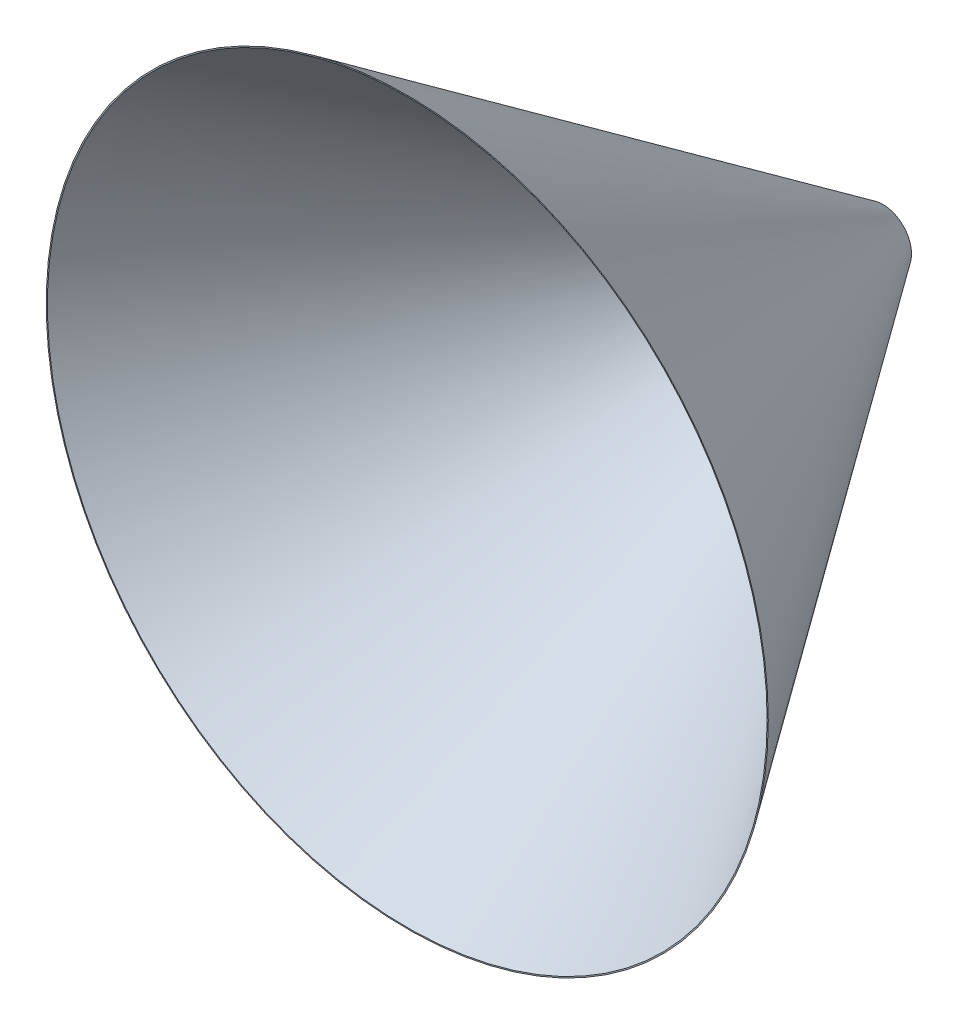
ISO-10303-21;
HEADER;
FILE_DESCRIPTION(('STEP AP214'),'2;1');
FILE_NAME('part.step','',(''),(''),'','','');
FILE_SCHEMA(('AUTOMOTIVE_DESIGN { 1 0 10303 214 1 1 1 1 }'));
ENDSEC;
DATA;
#1=APPLICATION_CONTEXT('core data for automotive mechanical design processes');
#2=APPLICATION_PROTOCOL_DEFINITION('international standard','automotive_design',2000,#1);
#3=PRODUCT_CONTEXT('',#1,'mechanical');
#4=PRODUCT('Part','Part','',(#3));
#5=PRODUCT_RELATED_PRODUCT_CATEGORY('part','',(#4));
#6=PRODUCT_DEFINITION_FORMATION('','',#4);
#7=PRODUCT_DEFINITION_CONTEXT('part definition',#1,'design');
#8=PRODUCT_DEFINITION('design','',#6,#7);
#9=PRODUCT_DEFINITION_SHAPE('','',#8);
#10=(LENGTH_UNIT() NAMED_UNIT(*) SI_UNIT(.MILLI.,.METRE.));
#11=(NAMED_UNIT(*) PLANE_ANGLE_UNIT() SI_UNIT($,.RADIAN.));
#12=(NAMED_UNIT(*) SI_UNIT($,.STERADIAN.) SOLID_ANGLE_UNIT());
#13=UNCERTAINTY_MEASURE_WITH_UNIT(LENGTH_MEASURE(1.E-05),#10,'distance_accuracy_value','');
#14=(GEOMETRIC_REPRESENTATION_CONTEXT(3) GLOBAL_UNCERTAINTY_ASSIGNED_CONTEXT((#13)) GLOBAL_UNIT_ASSIGNED_CONTEXT((#10,
#11,#12)) REPRESENTATION_CONTEXT('',''));
#15=CARTESIAN_POINT('',(0.,0.,0.));
#16=DIRECTION('',(0.,0.,1.));
#17=DIRECTION('',(1.,0.,0.));
#18=AXIS2_PLACEMENT_3D('',#15,#16,#17);
#19=CARTESIAN_POINT('',(0.,0.,0.));
#20=DIRECTION('',(0.,0.,1.));
#21=DIRECTION('',(1.,0.,0.));
#22=AXIS2_PLACEMENT_3D('',#19,#20,#21);
#23=CONICAL_SURFACE('',#22,3.,0.60999257357202);
#24=CARTESIAN_POINT('',(0.,0.,50.));
#25=DIRECTION('',(0.,0.,1.));
#26=DIRECTION('',(1.,0.,0.));
#27=AXIS2_PLACEMENT_3D('',#24,#25,#26);
#28=CIRCLE('',#27,37.9453904094492);
#29=CARTESIAN_POINT('',(37.9453904094492,0.,50.));
#30=VERTEX_POINT('',#29);
#31=EDGE_CURVE('E10',#30,#30,#28,.T.);
#32=CARTESIAN_POINT('',(0.,0.,0.));
#33=DIRECTION('',(0.,0.,1.));
#34=DIRECTION('',(1.,0.,0.));
#35=AXIS2_PLACEMENT_3D('',#32,#33,#34);
#36=CIRCLE('',#35,3.);
#37=CARTESIAN_POINT('',(3.,0.,0.));
#38=VERTEX_POINT('',#37);
#39=EDGE_CURVE('E38',#38,#38,#36,.T.);
#40=CARTESIAN_POINT('',(37.9453904094492,0.,50.));
#41=CARTESIAN_POINT('',(37.5813759260174,0.,49.4791666666667));
#42=CARTESIAN_POINT('',(37.2173614425857,0.,48.9583333333333));
#43=CARTESIAN_POINT('',(36.4893324757221,0.,47.9166666666667));
#44=CARTESIAN_POINT('',(36.1253179922904,0.,47.3958333333333));
#45=CARTESIAN_POINT('',(35.3972890254268,0.,46.3541666666667));
#46=CARTESIAN_POINT('',(35.0332745419951,0.,45.8333333333333));
#47=CARTESIAN_POINT('',(34.3052455751316,0.,44.7916666666667));
#48=CARTESIAN_POINT('',(33.9412310916998,0.,44.2708333333333));
#49=CARTESIAN_POINT('',(33.2132021248363,0.,43.2291666666667));
#50=CARTESIAN_POINT('',(32.8491876414045,0.,42.7083333333333));
#51=CARTESIAN_POINT('',(32.121158674541,0.,41.6666666666667));
#52=CARTESIAN_POINT('',(31.7571441911092,0.,41.1458333333333));
#53=CARTESIAN_POINT('',(31.0291152242457,0.,40.1041666666667));
#54=CARTESIAN_POINT('',(30.6651007408139,0.,39.5833333333333));
#55=CARTESIAN_POINT('',(29.9370717739504,0.,38.5416666666667));
#56=CARTESIAN_POINT('',(29.5730572905186,0.,38.0208333333333));
#57=CARTESIAN_POINT('',(28.8450283236551,0.,36.9791666666667));
#58=CARTESIAN_POINT('',(28.4810138402234,0.,36.4583333333333));
#59=CARTESIAN_POINT('',(27.7529848733598,0.,35.4166666666667));
#60=CARTESIAN_POINT('',(27.3889703899281,0.,34.8958333333333));
#61=CARTESIAN_POINT('',(26.6609414230645,0.,33.8541666666667));
#62=CARTESIAN_POINT('',(26.2969269396328,0.,33.3333333333333));
#63=CARTESIAN_POINT('',(25.5688979727693,0.,32.2916666666667));
#64=CARTESIAN_POINT('',(25.2048834893375,0.,31.7708333333333));
#65=CARTESIAN_POINT('',(24.476854522474,0.,30.7291666666667));
#66=CARTESIAN_POINT('',(24.1128400390422,0.,30.2083333333333));
#67=CARTESIAN_POINT('',(23.3848110721787,0.,29.1666666666667));
#68=CARTESIAN_POINT('',(23.0207965887469,0.,28.6458333333333));
#69=CARTESIAN_POINT('',(22.2927676218834,0.,27.6041666666667));
#70=CARTESIAN_POINT('',(21.9287531384516,0.,27.0833333333333));
#71=CARTESIAN_POINT('',(21.2007241715881,0.,26.0416666666667));
#72=CARTESIAN_POINT('',(20.8367096881564,0.,25.5208333333333));
#73=CARTESIAN_POINT('',(20.1086807212928,0.,24.4791666666667));
#74=CARTESIAN_POINT('',(19.7446662378611,0.,23.9583333333333));
#75=CARTESIAN_POINT('',(19.0166372709975,0.,22.9166666666667));
#76=CARTESIAN_POINT('',(18.6526227875658,0.,22.3958333333333));
#77=CARTESIAN_POINT('',(17.9245938207023,0.,21.3541666666667));
#78=CARTESIAN_POINT('',(17.5605793372705,0.,20.8333333333333));
#79=CARTESIAN_POINT('',(16.832550370407,0.,19.7916666666667));
#80=CARTESIAN_POINT('',(16.4685358869752,0.,19.2708333333333));
#81=CARTESIAN_POINT('',(15.7405069201117,0.,18.2291666666667));
#82=CARTESIAN_POINT('',(15.3764924366799,0.,17.7083333333333));
#83=CARTESIAN_POINT('',(14.6484634698164,0.,16.6666666666667));
#84=CARTESIAN_POINT('',(14.2844489863846,0.,16.1458333333333));
#85=CARTESIAN_POINT('',(13.5564200195211,0.,15.1041666666667));
#86=CARTESIAN_POINT('',(13.1924055360893,0.,14.5833333333333));
#87=CARTESIAN_POINT('',(12.4643765692258,0.,13.5416666666667));
#88=CARTESIAN_POINT('',(12.1003620857941,0.,13.0208333333333));
#89=CARTESIAN_POINT('',(11.3723331189305,0.,11.9791666666667));
#90=CARTESIAN_POINT('',(11.0083186354988,0.,11.4583333333333));
#91=CARTESIAN_POINT('',(10.2802896686352,0.,10.4166666666667));
#92=CARTESIAN_POINT('',(9.91627518520349,0.,9.89583333333333));
#93=CARTESIAN_POINT('',(9.18824621833996,0.,8.85416666666667));
#94=CARTESIAN_POINT('',(8.8242317349082,0.,8.33333333333333));
#95=CARTESIAN_POINT('',(8.09620276804467,0.,7.29166666666667));
#96=CARTESIAN_POINT('',(7.73218828461291,0.,6.77083333333333));
#97=CARTESIAN_POINT('',(7.00415931774938,0.,5.72916666666666));
#98=CARTESIAN_POINT('',(6.64014483431762,0.,5.20833333333333));
#99=CARTESIAN_POINT('',(5.9121158674541,0.,4.16666666666667));
#100=CARTESIAN_POINT('',(5.54810138402234,0.,3.64583333333333));
#101=CARTESIAN_POINT('',(4.82007241715881,0.,2.60416666666667));
#102=CARTESIAN_POINT('',(4.45605793372705,0.,2.08333333333334));
#103=CARTESIAN_POINT('',(3.72802896686353,0.,1.04166666666667));
#104=CARTESIAN_POINT('',(3.36401448343176,0.,0.520833333333334));
#105=CARTESIAN_POINT('',(3.,0.,0.));
#106=B_SPLINE_CURVE_WITH_KNOTS('',3,(#40,#41,#42,#43,#44,#45,#46,#47,#48,#49,#50,#51,#52,#53,
#54,#55,#56,#57,#58,#59,#60,#61,#62,#63,#64,#65,#66,#67,#68,#69,#70,#71,#72,#73,#74,#75,#76,#77,
#78,#79,#80,#81,#82,#83,#84,#85,#86,#87,#88,#89,#90,#91,#92,#93,#94,#95,#96,#97,#98,#99,#100,
#101,#102,#103,#104,#105),.UNSPECIFIED.,.F.,.F.,(4,2,2,2,2,2,2,2,2,2,2,2,2,2,2,2,2,2,2,2,2,2,2,
2,2,2,2,2,2,2,2,2,4),(0.,1.90629618562616,3.81259237125232,5.71888855687847,7.62518474250462,
9.53148092813078,11.4377771137569,13.3440732993831,15.2503694850092,17.1566656706354,
19.0629618562616,20.9692580418877,22.8755542275139,24.78185041314,26.6881465987662,
28.5944427843924,30.5007389700185,32.4070351556447,34.3133313412708,36.219627526897,
38.1259237125231,40.0322198981493,41.9385160837755,43.8448122694016,45.7511084550278,
47.6574046406539,49.5637008262801,51.4699970119062,53.3762931975324,55.2825893831585,
57.1888855687847,59.0951817544108,61.001477940037),.UNSPECIFIED.);
#107=EDGE_CURVE('BSEAM32',#30,#38,#106,.T.);
#108=ORIENTED_EDGE('',*,*,#31,.F.);
#109=ORIENTED_EDGE('',*,*,#39,.T.);
#110=ORIENTED_EDGE('',*,*,#107,.T.);
#111=ORIENTED_EDGE('',*,*,#107,.F.);
#112=EDGE_LOOP('',(#108,#110,#109,#111));
#113=FACE_BOUND('',#112,.T.);
#114=ADVANCED_FACE('F32',(#113),#23,.T.);
#115=CARTESIAN_POINT('',(0.,0.,50.));
#116=DIRECTION('',(0.,0.,1.));
#117=DIRECTION('',(1.,0.,0.));
#118=AXIS2_PLACEMENT_3D('',#115,#116,#117);
#119=PLANE('',#118);
#120=CARTESIAN_POINT('',(0.,0.,50.));
#121=DIRECTION('',(0.,0.,1.));
#122=DIRECTION('',(1.,0.,0.));
#123=AXIS2_PLACEMENT_3D('',#120,#121,#122);
#124=CIRCLE('',#123,37.8233874535691);
#125=CARTESIAN_POINT('',(37.8233874535691,0.,50.));
#126=VERTEX_POINT('',#125);
#127=EDGE_CURVE('E42',#126,#126,#124,.T.);
#128=ORIENTED_EDGE('',*,*,#127,.F.);
#129=EDGE_LOOP('',(#128));
#130=FACE_BOUND('',#129,.T.);
#131=ORIENTED_EDGE('',*,*,#31,.T.);
#132=EDGE_LOOP('',(#131));
#133=FACE_BOUND('',#132,.T.);
#134=ADVANCED_FACE('F62',(#130,#133),#119,.T.);
#135=CARTESIAN_POINT('',(0.,0.,0.));
#136=DIRECTION('',(0.,0.,1.));
#137=DIRECTION('',(1.,0.,0.));
#138=AXIS2_PLACEMENT_3D('',#135,#136,#137);
#139=PLANE('',#138);
#140=CARTESIAN_POINT('',(0.,0.,0.));
#141=DIRECTION('',(0.,0.,1.));
#142=DIRECTION('',(1.,0.,0.));
#143=AXIS2_PLACEMENT_3D('',#140,#141,#142);
#144=CIRCLE('',#143,2.87799704411993);
#145=CARTESIAN_POINT('',(2.87799704411993,0.,0.));
#146=VERTEX_POINT('',#145);
#147=EDGE_CURVE('E46',#146,#146,#144,.T.);
#148=ORIENTED_EDGE('',*,*,#147,.T.);
#149=EDGE_LOOP('',(#148));
#150=FACE_BOUND('',#149,.T.);
#151=ORIENTED_EDGE('',*,*,#39,.F.);
#152=EDGE_LOOP('',(#151));
#153=FACE_BOUND('',#152,.T.);
#154=ADVANCED_FACE('F52',(#150,#153),#139,.F.);
#155=CARTESIAN_POINT('',(0.,0.,0.057286137302771));
#156=DIRECTION('',(0.,0.,1.));
#157=DIRECTION('',(1.,0.,0.));
#158=AXIS2_PLACEMENT_3D('',#155,#156,#157);
#159=CONICAL_SURFACE('',#158,2.91803477278182,0.60999257357202);
#160=CARTESIAN_POINT('',(37.8233874535691,0.,50.));
#161=CARTESIAN_POINT('',(37.4593729701373,0.,49.4791666666667));
#162=CARTESIAN_POINT('',(37.0953584867056,0.,48.9583333333333));
#163=CARTESIAN_POINT('',(36.367329519842,0.,47.9166666666667));
#164=CARTESIAN_POINT('',(36.0033150364103,0.,47.3958333333333));
#165=CARTESIAN_POINT('',(35.2752860695468,0.,46.3541666666667));
#166=CARTESIAN_POINT('',(34.911271586115,0.,45.8333333333333));
#167=CARTESIAN_POINT('',(34.1832426192515,0.,44.7916666666667));
#168=CARTESIAN_POINT('',(33.8192281358197,0.,44.2708333333333));
#169=CARTESIAN_POINT('',(33.0911991689562,0.,43.2291666666667));
#170=CARTESIAN_POINT('',(32.7271846855244,0.,42.7083333333333));
#171=CARTESIAN_POINT('',(31.9991557186609,0.,41.6666666666667));
#172=CARTESIAN_POINT('',(31.6351412352291,0.,41.1458333333333));
#173=CARTESIAN_POINT('',(30.9071122683656,0.,40.1041666666667));
#174=CARTESIAN_POINT('',(30.5430977849339,0.,39.5833333333333));
#175=CARTESIAN_POINT('',(29.8150688180703,0.,38.5416666666667));
#176=CARTESIAN_POINT('',(29.4510543346386,0.,38.0208333333333));
#177=CARTESIAN_POINT('',(28.723025367775,0.,36.9791666666667));
#178=CARTESIAN_POINT('',(28.3590108843433,0.,36.4583333333333));
#179=CARTESIAN_POINT('',(27.6309819174798,0.,35.4166666666667));
#180=CARTESIAN_POINT('',(27.266967434048,0.,34.8958333333333));
#181=CARTESIAN_POINT('',(26.5389384671845,0.,33.8541666666667));
#182=CARTESIAN_POINT('',(26.1749239837527,0.,33.3333333333333));
#183=CARTESIAN_POINT('',(25.4468950168892,0.,32.2916666666667));
#184=CARTESIAN_POINT('',(25.0828805334574,0.,31.7708333333333));
#185=CARTESIAN_POINT('',(24.3548515665939,0.,30.7291666666667));
#186=CARTESIAN_POINT('',(23.9908370831621,0.,30.2083333333333));
#187=CARTESIAN_POINT('',(23.2628081162986,0.,29.1666666666667));
#188=CARTESIAN_POINT('',(22.8987936328668,0.,28.6458333333333));
#189=CARTESIAN_POINT('',(22.1707646660033,0.,27.6041666666667));
#190=CARTESIAN_POINT('',(21.8067501825716,0.,27.0833333333333));
#191=CARTESIAN_POINT('',(21.078721215708,0.,26.0416666666667));
#192=CARTESIAN_POINT('',(20.7147067322763,0.,25.5208333333333));
#193=CARTESIAN_POINT('',(19.9866777654128,0.,24.4791666666667));
#194=CARTESIAN_POINT('',(19.622663281981,0.,23.9583333333333));
#195=CARTESIAN_POINT('',(18.8946343151175,0.,22.9166666666667));
#196=CARTESIAN_POINT('',(18.5306198316857,0.,22.3958333333333));
#197=CARTESIAN_POINT('',(17.8025908648222,0.,21.3541666666667));
#198=CARTESIAN_POINT('',(17.4385763813904,0.,20.8333333333333));
#199=CARTESIAN_POINT('',(16.7105474145269,0.,19.7916666666667));
#200=CARTESIAN_POINT('',(16.3465329310951,0.,19.2708333333333));
#201=CARTESIAN_POINT('',(15.6185039642316,0.,18.2291666666667));
#202=CARTESIAN_POINT('',(15.2544894807998,0.,17.7083333333333));
#203=CARTESIAN_POINT('',(14.5264605139363,0.,16.6666666666667));
#204=CARTESIAN_POINT('',(14.1624460305046,0.,16.1458333333333));
#205=CARTESIAN_POINT('',(13.434417063641,0.,15.1041666666667));
#206=CARTESIAN_POINT('',(13.0704025802093,0.,14.5833333333333));
#207=CARTESIAN_POINT('',(12.3423736133457,0.,13.5416666666667));
#208=CARTESIAN_POINT('',(11.978359129914,0.,13.0208333333333));
#209=CARTESIAN_POINT('',(11.2503301630505,0.,11.9791666666667));
#210=CARTESIAN_POINT('',(10.8863156796187,0.,11.4583333333333));
#211=CARTESIAN_POINT('',(10.1582867127552,0.,10.4166666666667));
#212=CARTESIAN_POINT('',(9.79427222932341,0.,9.89583333333334));
#213=CARTESIAN_POINT('',(9.06624326245988,0.,8.85416666666667));
#214=CARTESIAN_POINT('',(8.70222877902812,0.,8.33333333333334));
#215=CARTESIAN_POINT('',(7.9741998121646,0.,7.29166666666667));
#216=CARTESIAN_POINT('',(7.61018532873284,0.,6.77083333333333));
#217=CARTESIAN_POINT('',(6.88215636186931,0.,5.72916666666667));
#218=CARTESIAN_POINT('',(6.51814187843755,0.,5.20833333333333));
#219=CARTESIAN_POINT('',(5.79011291157402,0.,4.16666666666667));
#220=CARTESIAN_POINT('',(5.42609842814226,0.,3.64583333333334));
#221=CARTESIAN_POINT('',(4.69806946127874,0.,2.60416666666667));
#222=CARTESIAN_POINT('',(4.33405497784698,0.,2.08333333333334));
#223=CARTESIAN_POINT('',(3.60602601098345,0.,1.04166666666667));
#224=CARTESIAN_POINT('',(3.24201152755169,0.,0.520833333333335));
#225=CARTESIAN_POINT('',(2.87799704411993,0.,0.));
#226=B_SPLINE_CURVE_WITH_KNOTS('',3,(#160,#161,#162,#163,#164,#165,#166,#167,#168,#169,#170,
#171,#172,#173,#174,#175,#176,#177,#178,#179,#180,#181,#182,#183,#184,#185,#186,#187,#188,#189,
#190,#191,#192,#193,#194,#195,#196,#197,#198,#199,#200,#201,#202,#203,#204,#205,#206,#207,#208,
#209,#210,#211,#212,#213,#214,#215,#216,#217,#218,#219,#220,#221,#222,#223,#224,#225),
.UNSPECIFIED.,.F.,.F.,(4,2,2,2,2,2,2,2,2,2,2,2,2,2,2,2,2,2,2,2,2,2,2,2,2,2,2,2,2,2,2,2,4),(0.,
1.90629618562616,3.81259237125232,5.71888855687847,7.62518474250462,9.53148092813078,
11.4377771137569,13.3440732993831,15.2503694850092,17.1566656706354,19.0629618562616,
20.9692580418877,22.8755542275139,24.78185041314,26.6881465987662,28.5944427843923,
30.5007389700185,32.4070351556447,34.3133313412708,36.219627526897,38.1259237125231,
40.0322198981493,41.9385160837754,43.8448122694016,45.7511084550277,47.6574046406539,
49.5637008262801,51.4699970119062,53.3762931975324,55.2825893831585,57.1888855687847,
59.0951817544108,61.001477940037),.UNSPECIFIED.);
#227=EDGE_CURVE('BSEAM55',#126,#146,#226,.T.);
#228=ORIENTED_EDGE('',*,*,#127,.T.);
#229=ORIENTED_EDGE('',*,*,#147,.F.);
#230=ORIENTED_EDGE('',*,*,#227,.T.);
#231=ORIENTED_EDGE('',*,*,#227,.F.);
#232=EDGE_LOOP('',(#228,#230,#229,#231));
#233=FACE_BOUND('',#232,.T.);
#234=ADVANCED_FACE('F55',(#233),#159,.F.);
#235=CLOSED_SHELL('',(#114,#134,#154,#234));
#236=MANIFOLD_SOLID_BREP('B2',#235);
#237=ADVANCED_BREP_SHAPE_REPRESENTATION('',(#18,#236),#14);
#238=SHAPE_DEFINITION_REPRESENTATION(#9,#237);
ENDSEC;
END-ISO-10303-21;
